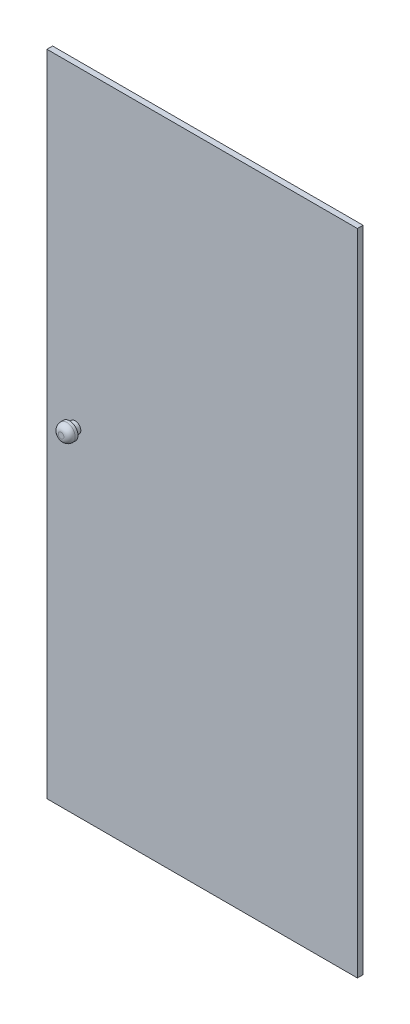
ISO-10303-21;
HEADER;
FILE_DESCRIPTION(('STEP AP214'),'2;1');
FILE_NAME('part.step','',(''),(''),'','','');
FILE_SCHEMA(('AUTOMOTIVE_DESIGN { 1 0 10303 214 1 1 1 1 }'));
ENDSEC;
DATA;
#1=APPLICATION_CONTEXT('core data for automotive mechanical design processes');
#2=APPLICATION_PROTOCOL_DEFINITION('international standard','automotive_design',2000,#1);
#3=PRODUCT_CONTEXT('',#1,'mechanical');
#4=PRODUCT('Part','Part','',(#3));
#5=PRODUCT_RELATED_PRODUCT_CATEGORY('part','',(#4));
#6=PRODUCT_DEFINITION_FORMATION('','',#4);
#7=PRODUCT_DEFINITION_CONTEXT('part definition',#1,'design');
#8=PRODUCT_DEFINITION('design','',#6,#7);
#9=PRODUCT_DEFINITION_SHAPE('','',#8);
#10=(LENGTH_UNIT() NAMED_UNIT(*) SI_UNIT(.MILLI.,.METRE.));
#11=(NAMED_UNIT(*) PLANE_ANGLE_UNIT() SI_UNIT($,.RADIAN.));
#12=(NAMED_UNIT(*) SI_UNIT($,.STERADIAN.) SOLID_ANGLE_UNIT());
#13=UNCERTAINTY_MEASURE_WITH_UNIT(LENGTH_MEASURE(1.E-05),#10,'distance_accuracy_value','');
#14=(GEOMETRIC_REPRESENTATION_CONTEXT(3) GLOBAL_UNCERTAINTY_ASSIGNED_CONTEXT((#13)) GLOBAL_UNIT_ASSIGNED_CONTEXT((#10,
#11,#12)) REPRESENTATION_CONTEXT('',''));
#15=CARTESIAN_POINT('',(0.,0.,0.));
#16=DIRECTION('',(0.,0.,1.));
#17=DIRECTION('',(1.,0.,0.));
#18=AXIS2_PLACEMENT_3D('',#15,#16,#17);
#19=CARTESIAN_POINT('',(-275.,-575.,10.));
#20=DIRECTION('',(1.,0.,0.));
#21=DIRECTION('',(0.,0.,-1.));
#22=AXIS2_PLACEMENT_3D('',#19,#20,#21);
#23=PLANE('',#22);
#24=DIRECTION('',(0.,-1.,0.));
#25=VECTOR('',#24,1.);
#26=CARTESIAN_POINT('',(-275.,-575.,0.));
#27=LINE('',#26,#25);
#28=CARTESIAN_POINT('',(-275.,575.,0.));
#29=VERTEX_POINT('',#28);
#30=CARTESIAN_POINT('',(-275.,-575.,0.));
#31=VERTEX_POINT('',#30);
#32=EDGE_CURVE('E100',#29,#31,#27,.T.);
#33=ORIENTED_EDGE('',*,*,#32,.T.);
#34=DIRECTION('',(0.,0.,-1.));
#35=VECTOR('',#34,1.);
#36=CARTESIAN_POINT('',(-275.,-575.,10.));
#37=LINE('',#36,#35);
#38=CARTESIAN_POINT('',(-275.,-575.,10.));
#39=VERTEX_POINT('',#38);
#40=EDGE_CURVE('E91',#39,#31,#37,.T.);
#41=ORIENTED_EDGE('',*,*,#40,.F.);
#42=DIRECTION('',(0.,-1.,0.));
#43=VECTOR('',#42,1.);
#44=CARTESIAN_POINT('',(-275.,-575.,10.));
#45=LINE('',#44,#43);
#46=CARTESIAN_POINT('',(-275.,575.,10.));
#47=VERTEX_POINT('',#46);
#48=EDGE_CURVE('E85',#47,#39,#45,.T.);
#49=ORIENTED_EDGE('',*,*,#48,.F.);
#50=DIRECTION('',(0.,0.,-1.));
#51=VECTOR('',#50,1.);
#52=CARTESIAN_POINT('',(-275.,575.,10.));
#53=LINE('',#52,#51);
#54=EDGE_CURVE('E96',#47,#29,#53,.T.);
#55=ORIENTED_EDGE('',*,*,#54,.T.);
#56=EDGE_LOOP('',(#33,#41,#49,#55));
#57=FACE_BOUND('',#56,.T.);
#58=ADVANCED_FACE('F32',(#57),#23,.F.);
#59=CARTESIAN_POINT('',(275.,-575.,10.));
#60=DIRECTION('',(0.,1.,0.));
#61=DIRECTION('',(-1.,0.,0.));
#62=AXIS2_PLACEMENT_3D('',#59,#60,#61);
#63=PLANE('',#62);
#64=DIRECTION('',(1.,0.,0.));
#65=VECTOR('',#64,1.);
#66=CARTESIAN_POINT('',(275.,-575.,0.));
#67=LINE('',#66,#65);
#68=CARTESIAN_POINT('',(275.,-575.,0.));
#69=VERTEX_POINT('',#68);
#70=EDGE_CURVE('E90',#31,#69,#67,.T.);
#71=ORIENTED_EDGE('',*,*,#70,.T.);
#72=DIRECTION('',(0.,0.,-1.));
#73=VECTOR('',#72,1.);
#74=CARTESIAN_POINT('',(275.,-575.,10.));
#75=LINE('',#74,#73);
#76=CARTESIAN_POINT('',(275.,-575.,10.));
#77=VERTEX_POINT('',#76);
#78=EDGE_CURVE('E88',#77,#69,#75,.T.);
#79=ORIENTED_EDGE('',*,*,#78,.F.);
#80=DIRECTION('',(1.,0.,0.));
#81=VECTOR('',#80,1.);
#82=CARTESIAN_POINT('',(275.,-575.,10.));
#83=LINE('',#82,#81);
#84=EDGE_CURVE('E80',#39,#77,#83,.T.);
#85=ORIENTED_EDGE('',*,*,#84,.F.);
#86=ORIENTED_EDGE('',*,*,#40,.T.);
#87=EDGE_LOOP('',(#71,#79,#85,#86));
#88=FACE_BOUND('',#87,.T.);
#89=ADVANCED_FACE('F89',(#88),#63,.F.);
#90=CARTESIAN_POINT('',(275.,-575.,10.));
#91=DIRECTION('',(-1.,0.,0.));
#92=DIRECTION('',(0.,0.,1.));
#93=AXIS2_PLACEMENT_3D('',#90,#91,#92);
#94=PLANE('',#93);
#95=DIRECTION('',(0.,1.,0.));
#96=VECTOR('',#95,1.);
#97=CARTESIAN_POINT('',(275.,-575.,0.));
#98=LINE('',#97,#96);
#99=CARTESIAN_POINT('',(275.,575.,0.));
#100=VERTEX_POINT('',#99);
#101=EDGE_CURVE('E66',#69,#100,#98,.T.);
#102=ORIENTED_EDGE('',*,*,#101,.T.);
#103=DIRECTION('',(0.,0.,-1.));
#104=VECTOR('',#103,1.);
#105=CARTESIAN_POINT('',(275.,575.,10.));
#106=LINE('',#105,#104);
#107=CARTESIAN_POINT('',(275.,575.,10.));
#108=VERTEX_POINT('',#107);
#109=EDGE_CURVE('E92',#108,#100,#106,.T.);
#110=ORIENTED_EDGE('',*,*,#109,.F.);
#111=DIRECTION('',(0.,1.,0.));
#112=VECTOR('',#111,1.);
#113=CARTESIAN_POINT('',(275.,-575.,10.));
#114=LINE('',#113,#112);
#115=EDGE_CURVE('E83',#77,#108,#114,.T.);
#116=ORIENTED_EDGE('',*,*,#115,.F.);
#117=ORIENTED_EDGE('',*,*,#78,.T.);
#118=EDGE_LOOP('',(#102,#110,#116,#117));
#119=FACE_BOUND('',#118,.T.);
#120=ADVANCED_FACE('F94',(#119),#94,.F.);
#121=CARTESIAN_POINT('',(275.,575.,10.));
#122=DIRECTION('',(0.,-1.,0.));
#123=DIRECTION('',(1.,0.,0.));
#124=AXIS2_PLACEMENT_3D('',#121,#122,#123);
#125=PLANE('',#124);
#126=DIRECTION('',(-1.,0.,0.));
#127=VECTOR('',#126,1.);
#128=CARTESIAN_POINT('',(275.,575.,0.));
#129=LINE('',#128,#127);
#130=EDGE_CURVE('E72',#100,#29,#129,.T.);
#131=ORIENTED_EDGE('',*,*,#130,.T.);
#132=ORIENTED_EDGE('',*,*,#54,.F.);
#133=DIRECTION('',(-1.,0.,0.));
#134=VECTOR('',#133,1.);
#135=CARTESIAN_POINT('',(275.,575.,10.));
#136=LINE('',#135,#134);
#137=EDGE_CURVE('E49',#108,#47,#136,.T.);
#138=ORIENTED_EDGE('',*,*,#137,.F.);
#139=ORIENTED_EDGE('',*,*,#109,.T.);
#140=EDGE_LOOP('',(#131,#132,#138,#139));
#141=FACE_BOUND('',#140,.T.);
#142=ADVANCED_FACE('F132',(#141),#125,.F.);
#143=CARTESIAN_POINT('',(0.,0.,10.));
#144=DIRECTION('',(0.,0.,1.));
#145=DIRECTION('',(1.,0.,0.));
#146=AXIS2_PLACEMENT_3D('',#143,#144,#145);
#147=PLANE('',#146);
#148=CARTESIAN_POINT('',(-225.,20.,10.));
#149=DIRECTION('',(0.,0.,1.));
#150=DIRECTION('',(1.,0.,0.));
#151=AXIS2_PLACEMENT_3D('',#148,#149,#150);
#152=CIRCLE('',#151,10.);
#153=CARTESIAN_POINT('',(-215.,20.,10.));
#154=VERTEX_POINT('',#153);
#155=EDGE_CURVE('E218',#154,#154,#152,.T.);
#156=ORIENTED_EDGE('',*,*,#155,.F.);
#157=EDGE_LOOP('',(#156));
#158=FACE_BOUND('',#157,.T.);
#159=ORIENTED_EDGE('',*,*,#48,.T.);
#160=ORIENTED_EDGE('',*,*,#84,.T.);
#161=ORIENTED_EDGE('',*,*,#115,.T.);
#162=ORIENTED_EDGE('',*,*,#137,.T.);
#163=EDGE_LOOP('',(#159,#160,#161,#162));
#164=FACE_BOUND('',#163,.T.);
#165=ADVANCED_FACE('F81',(#158,#164),#147,.T.);
#166=CARTESIAN_POINT('',(0.,0.,0.));
#167=DIRECTION('',(0.,0.,1.));
#168=DIRECTION('',(1.,0.,0.));
#169=AXIS2_PLACEMENT_3D('',#166,#167,#168);
#170=PLANE('',#169);
#171=ORIENTED_EDGE('',*,*,#32,.F.);
#172=ORIENTED_EDGE('',*,*,#130,.F.);
#173=ORIENTED_EDGE('',*,*,#101,.F.);
#174=ORIENTED_EDGE('',*,*,#70,.F.);
#175=EDGE_LOOP('',(#171,#172,#173,#174));
#176=FACE_BOUND('',#175,.T.);
#177=ADVANCED_FACE('F135',(#176),#170,.F.);
#178=CARTESIAN_POINT('',(-225.,20.,20.));
#179=DIRECTION('',(0.,0.,-1.));
#180=DIRECTION('',(-1.,0.,0.));
#181=AXIS2_PLACEMENT_3D('',#178,#179,#180);
#182=CYLINDRICAL_SURFACE('',#181,10.);
#183=CARTESIAN_POINT('',(-225.,20.,20.));
#184=DIRECTION('',(0.,0.,1.));
#185=DIRECTION('',(1.,0.,0.));
#186=AXIS2_PLACEMENT_3D('',#183,#184,#185);
#187=CIRCLE('',#186,10.);
#188=CARTESIAN_POINT('',(-215.,20.,20.));
#189=VERTEX_POINT('',#188);
#190=EDGE_CURVE('E103',#189,#189,#187,.T.);
#191=ORIENTED_EDGE('',*,*,#190,.F.);
#192=EDGE_LOOP('',(#191));
#193=FACE_BOUND('',#192,.T.);
#194=ORIENTED_EDGE('',*,*,#155,.T.);
#195=EDGE_LOOP('',(#194));
#196=FACE_BOUND('',#195,.T.);
#197=ADVANCED_FACE('F138',(#193,#196),#182,.T.);
#198=CARTESIAN_POINT('',(-225.,20.,35.));
#199=DIRECTION('',(0.,0.,-1.));
#200=DIRECTION('',(-1.,0.,0.));
#201=AXIS2_PLACEMENT_3D('',#198,#199,#200);
#202=CYLINDRICAL_SURFACE('',#201,15.);
#203=CARTESIAN_POINT('',(-225.,20.,25.));
#204=DIRECTION('',(0.,0.,1.));
#205=DIRECTION('',(1.,0.,0.));
#206=AXIS2_PLACEMENT_3D('',#203,#204,#205);
#207=CIRCLE('',#206,15.);
#208=CARTESIAN_POINT('',(-210.,20.,25.));
#209=VERTEX_POINT('',#208);
#210=EDGE_CURVE('E11',#209,#209,#207,.F.);
#211=ORIENTED_EDGE('',*,*,#210,.T.);
#212=EDGE_LOOP('',(#211));
#213=FACE_BOUND('',#212,.T.);
#214=CARTESIAN_POINT('',(-225.,20.,20.));
#215=DIRECTION('',(0.,0.,1.));
#216=DIRECTION('',(1.,0.,0.));
#217=AXIS2_PLACEMENT_3D('',#214,#215,#216);
#218=CIRCLE('',#217,15.);
#219=CARTESIAN_POINT('',(-210.,20.,20.));
#220=VERTEX_POINT('',#219);
#221=EDGE_CURVE('E216',#220,#220,#218,.T.);
#222=ORIENTED_EDGE('',*,*,#221,.T.);
#223=EDGE_LOOP('',(#222));
#224=FACE_BOUND('',#223,.T.);
#225=ADVANCED_FACE('F145',(#213,#224),#202,.T.);
#226=CARTESIAN_POINT('',(-225.,20.,35.));
#227=DIRECTION('',(0.,0.,1.));
#228=DIRECTION('',(1.,0.,0.));
#229=AXIS2_PLACEMENT_3D('',#226,#227,#228);
#230=PLANE('',#229);
#231=CARTESIAN_POINT('',(-225.,20.,35.));
#232=DIRECTION('',(0.,0.,1.));
#233=DIRECTION('',(1.,0.,0.));
#234=AXIS2_PLACEMENT_3D('',#231,#232,#233);
#235=CIRCLE('',#234,5.00000000000002);
#236=CARTESIAN_POINT('',(-220.,20.,35.));
#237=VERTEX_POINT('',#236);
#238=EDGE_CURVE('E41',#237,#237,#235,.T.);
#239=ORIENTED_EDGE('',*,*,#238,.T.);
#240=EDGE_LOOP('',(#239));
#241=FACE_BOUND('',#240,.T.);
#242=ADVANCED_FACE('F112',(#241),#230,.T.);
#243=CARTESIAN_POINT('',(-225.,20.,20.));
#244=DIRECTION('',(0.,0.,1.));
#245=DIRECTION('',(1.,0.,0.));
#246=AXIS2_PLACEMENT_3D('',#243,#244,#245);
#247=PLANE('',#246);
#248=ORIENTED_EDGE('',*,*,#190,.T.);
#249=EDGE_LOOP('',(#248));
#250=FACE_BOUND('',#249,.T.);
#251=ORIENTED_EDGE('',*,*,#221,.F.);
#252=EDGE_LOOP('',(#251));
#253=FACE_BOUND('',#252,.T.);
#254=ADVANCED_FACE('F115',(#250,#253),#247,.F.);
#255=CARTESIAN_POINT('',(-225.,20.,25.));
#256=DIRECTION('',(0.,0.,1.));
#257=DIRECTION('',(1.,0.,0.));
#258=AXIS2_PLACEMENT_3D('',#255,#256,#257);
#259=DEGENERATE_TOROIDAL_SURFACE('',#258,5.00000000000002,10.,.T.);
#260=ORIENTED_EDGE('',*,*,#210,.F.);
#261=EDGE_LOOP('',(#260));
#262=FACE_BOUND('',#261,.T.);
#263=ORIENTED_EDGE('',*,*,#238,.F.);
#264=EDGE_LOOP('',(#263));
#265=FACE_BOUND('',#264,.T.);
#266=ADVANCED_FACE('F34',(#262,#265),#259,.T.);
#267=CLOSED_SHELL('',(#58,#89,#120,#142,#165,#177,#197,#225,#242,#254,#266));
#268=MANIFOLD_SOLID_BREP('B2',#267);
#269=ADVANCED_BREP_SHAPE_REPRESENTATION('',(#18,#268),#14);
#270=SHAPE_DEFINITION_REPRESENTATION(#9,#269);
ENDSEC;
END-ISO-10303-21;
